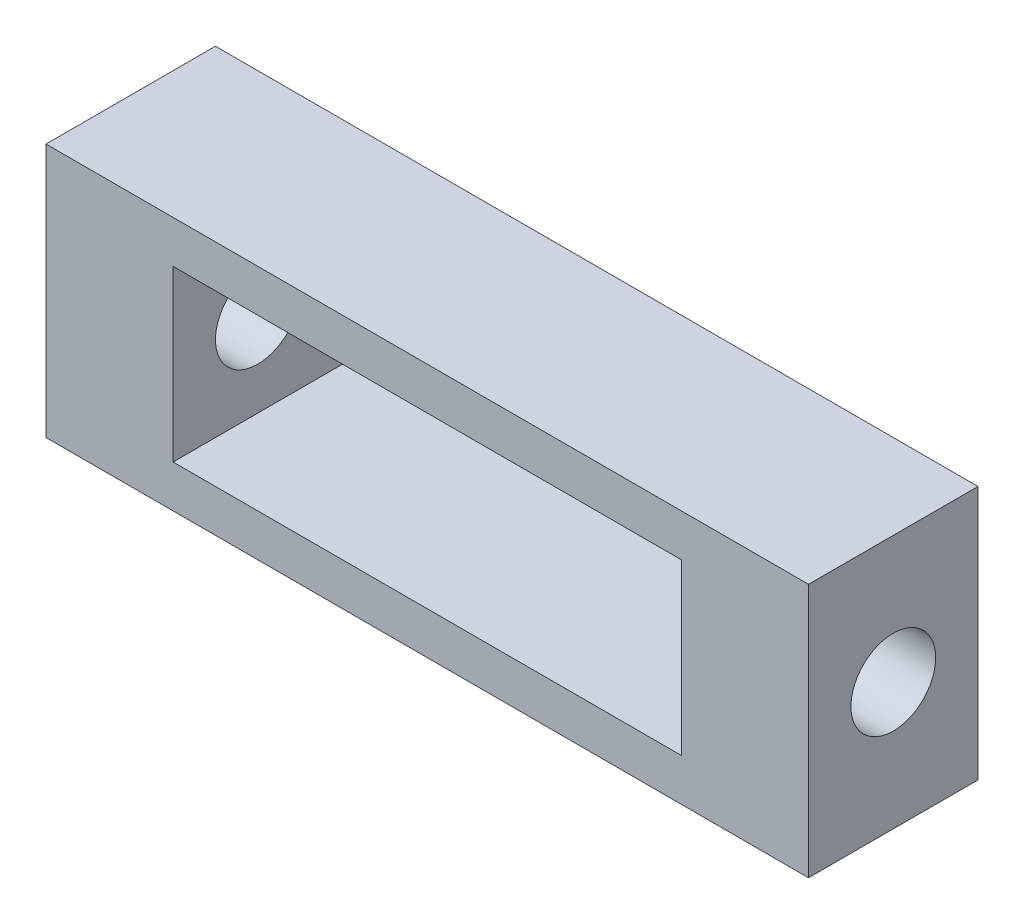
ISO-10303-21;
HEADER;
FILE_DESCRIPTION(('STEP AP214'),'2;1');
FILE_NAME('part.step','',(''),(''),'','','');
FILE_SCHEMA(('AUTOMOTIVE_DESIGN { 1 0 10303 214 1 1 1 1 }'));
ENDSEC;
DATA;
#1=APPLICATION_CONTEXT('core data for automotive mechanical design processes');
#2=APPLICATION_PROTOCOL_DEFINITION('international standard','automotive_design',2000,#1);
#3=PRODUCT_CONTEXT('',#1,'mechanical');
#4=PRODUCT('Part','Part','',(#3));
#5=PRODUCT_RELATED_PRODUCT_CATEGORY('part','',(#4));
#6=PRODUCT_DEFINITION_FORMATION('','',#4);
#7=PRODUCT_DEFINITION_CONTEXT('part definition',#1,'design');
#8=PRODUCT_DEFINITION('design','',#6,#7);
#9=PRODUCT_DEFINITION_SHAPE('','',#8);
#10=(LENGTH_UNIT() NAMED_UNIT(*) SI_UNIT(.MILLI.,.METRE.));
#11=(NAMED_UNIT(*) PLANE_ANGLE_UNIT() SI_UNIT($,.RADIAN.));
#12=(NAMED_UNIT(*) SI_UNIT($,.STERADIAN.) SOLID_ANGLE_UNIT());
#13=UNCERTAINTY_MEASURE_WITH_UNIT(LENGTH_MEASURE(1.E-05),#10,'distance_accuracy_value','');
#14=(GEOMETRIC_REPRESENTATION_CONTEXT(3) GLOBAL_UNCERTAINTY_ASSIGNED_CONTEXT((#13)) GLOBAL_UNIT_ASSIGNED_CONTEXT((#10,
#11,#12)) REPRESENTATION_CONTEXT('',''));
#15=CARTESIAN_POINT('',(0.,0.,0.));
#16=DIRECTION('',(0.,0.,1.));
#17=DIRECTION('',(1.,0.,0.));
#18=AXIS2_PLACEMENT_3D('',#15,#16,#17);
#19=CARTESIAN_POINT('',(0.,0.,10.));
#20=DIRECTION('',(0.,0.,1.));
#21=DIRECTION('',(1.,0.,0.));
#22=AXIS2_PLACEMENT_3D('',#19,#20,#21);
#23=PLANE('',#22);
#24=DIRECTION('',(0.,-1.,0.));
#25=VECTOR('',#24,1.);
#26=CARTESIAN_POINT('',(0.,0.,10.));
#27=LINE('',#26,#25);
#28=CARTESIAN_POINT('',(0.,0.,10.));
#29=VERTEX_POINT('',#28);
#30=CARTESIAN_POINT('',(0.,-15.,10.));
#31=VERTEX_POINT('',#30);
#32=EDGE_CURVE('E145',#29,#31,#27,.T.);
#33=ORIENTED_EDGE('',*,*,#32,.T.);
#34=DIRECTION('',(1.,0.,0.));
#35=VECTOR('',#34,1.);
#36=CARTESIAN_POINT('',(0.,-15.,10.));
#37=LINE('',#36,#35);
#38=CARTESIAN_POINT('',(45.,-15.,10.));
#39=VERTEX_POINT('',#38);
#40=EDGE_CURVE('E148',#31,#39,#37,.T.);
#41=ORIENTED_EDGE('',*,*,#40,.T.);
#42=DIRECTION('',(0.,1.,0.));
#43=VECTOR('',#42,1.);
#44=CARTESIAN_POINT('',(45.,0.,10.));
#45=LINE('',#44,#43);
#46=CARTESIAN_POINT('',(45.,0.,10.));
#47=VERTEX_POINT('',#46);
#48=EDGE_CURVE('E151',#39,#47,#45,.T.);
#49=ORIENTED_EDGE('',*,*,#48,.T.);
#50=DIRECTION('',(-1.,0.,0.));
#51=VECTOR('',#50,1.);
#52=CARTESIAN_POINT('',(0.,0.,10.));
#53=LINE('',#52,#51);
#54=EDGE_CURVE('E153',#47,#29,#53,.T.);
#55=ORIENTED_EDGE('',*,*,#54,.T.);
#56=EDGE_LOOP('',(#33,#41,#49,#55));
#57=FACE_BOUND('',#56,.T.);
#58=DIRECTION('',(1.,0.,0.));
#59=VECTOR('',#58,1.);
#60=CARTESIAN_POINT('',(7.5,-12.5,10.));
#61=LINE('',#60,#59);
#62=CARTESIAN_POINT('',(7.5,-12.5,10.));
#63=VERTEX_POINT('',#62);
#64=CARTESIAN_POINT('',(37.5,-12.5,10.));
#65=VERTEX_POINT('',#64);
#66=EDGE_CURVE('E115',#63,#65,#61,.T.);
#67=ORIENTED_EDGE('',*,*,#66,.F.);
#68=DIRECTION('',(0.,-1.,0.));
#69=VECTOR('',#68,1.);
#70=CARTESIAN_POINT('',(7.5,-2.5,10.));
#71=LINE('',#70,#69);
#72=CARTESIAN_POINT('',(7.5,-2.5,10.));
#73=VERTEX_POINT('',#72);
#74=EDGE_CURVE('E107',#73,#63,#71,.T.);
#75=ORIENTED_EDGE('',*,*,#74,.F.);
#76=DIRECTION('',(-1.,0.,0.));
#77=VECTOR('',#76,1.);
#78=CARTESIAN_POINT('',(7.5,-2.5,10.));
#79=LINE('',#78,#77);
#80=CARTESIAN_POINT('',(37.5,-2.5,10.));
#81=VERTEX_POINT('',#80);
#82=EDGE_CURVE('E129',#81,#73,#79,.T.);
#83=ORIENTED_EDGE('',*,*,#82,.F.);
#84=DIRECTION('',(0.,1.,0.));
#85=VECTOR('',#84,1.);
#86=CARTESIAN_POINT('',(37.5,-2.5,10.));
#87=LINE('',#86,#85);
#88=EDGE_CURVE('E127',#65,#81,#87,.T.);
#89=ORIENTED_EDGE('',*,*,#88,.F.);
#90=EDGE_LOOP('',(#67,#75,#83,#89));
#91=FACE_BOUND('',#90,.T.);
#92=ADVANCED_FACE('F41',(#57,#91),#23,.T.);
#93=CARTESIAN_POINT('',(0.,0.,0.));
#94=DIRECTION('',(0.,0.,1.));
#95=DIRECTION('',(1.,0.,0.));
#96=AXIS2_PLACEMENT_3D('',#93,#94,#95);
#97=PLANE('',#96);
#98=DIRECTION('',(0.,-1.,0.));
#99=VECTOR('',#98,1.);
#100=CARTESIAN_POINT('',(0.,0.,0.));
#101=LINE('',#100,#99);
#102=CARTESIAN_POINT('',(0.,0.,0.));
#103=VERTEX_POINT('',#102);
#104=CARTESIAN_POINT('',(0.,-15.,0.));
#105=VERTEX_POINT('',#104);
#106=EDGE_CURVE('E123',#103,#105,#101,.T.);
#107=ORIENTED_EDGE('',*,*,#106,.F.);
#108=DIRECTION('',(-1.,0.,0.));
#109=VECTOR('',#108,1.);
#110=CARTESIAN_POINT('',(0.,0.,0.));
#111=LINE('',#110,#109);
#112=CARTESIAN_POINT('',(45.,0.,0.));
#113=VERTEX_POINT('',#112);
#114=EDGE_CURVE('E149',#113,#103,#111,.T.);
#115=ORIENTED_EDGE('',*,*,#114,.F.);
#116=DIRECTION('',(0.,1.,0.));
#117=VECTOR('',#116,1.);
#118=CARTESIAN_POINT('',(45.,0.,0.));
#119=LINE('',#118,#117);
#120=CARTESIAN_POINT('',(45.,-15.,0.));
#121=VERTEX_POINT('',#120);
#122=EDGE_CURVE('E160',#121,#113,#119,.T.);
#123=ORIENTED_EDGE('',*,*,#122,.F.);
#124=DIRECTION('',(1.,0.,0.));
#125=VECTOR('',#124,1.);
#126=CARTESIAN_POINT('',(0.,-15.,0.));
#127=LINE('',#126,#125);
#128=EDGE_CURVE('E158',#105,#121,#127,.T.);
#129=ORIENTED_EDGE('',*,*,#128,.F.);
#130=EDGE_LOOP('',(#107,#115,#123,#129));
#131=FACE_BOUND('',#130,.T.);
#132=DIRECTION('',(0.,-1.,0.));
#133=VECTOR('',#132,1.);
#134=CARTESIAN_POINT('',(7.5,-2.5,0.));
#135=LINE('',#134,#133);
#136=CARTESIAN_POINT('',(7.5,-2.5,0.));
#137=VERTEX_POINT('',#136);
#138=CARTESIAN_POINT('',(7.5,-12.5,0.));
#139=VERTEX_POINT('',#138);
#140=EDGE_CURVE('E65',#137,#139,#135,.T.);
#141=ORIENTED_EDGE('',*,*,#140,.T.);
#142=DIRECTION('',(1.,0.,0.));
#143=VECTOR('',#142,1.);
#144=CARTESIAN_POINT('',(7.5,-12.5,0.));
#145=LINE('',#144,#143);
#146=CARTESIAN_POINT('',(37.5,-12.5,0.));
#147=VERTEX_POINT('',#146);
#148=EDGE_CURVE('E122',#139,#147,#145,.T.);
#149=ORIENTED_EDGE('',*,*,#148,.T.);
#150=DIRECTION('',(0.,1.,0.));
#151=VECTOR('',#150,1.);
#152=CARTESIAN_POINT('',(37.5,-2.5,0.));
#153=LINE('',#152,#151);
#154=CARTESIAN_POINT('',(37.5,-2.5,0.));
#155=VERTEX_POINT('',#154);
#156=EDGE_CURVE('E137',#147,#155,#153,.T.);
#157=ORIENTED_EDGE('',*,*,#156,.T.);
#158=DIRECTION('',(-1.,0.,0.));
#159=VECTOR('',#158,1.);
#160=CARTESIAN_POINT('',(7.5,-2.5,0.));
#161=LINE('',#160,#159);
#162=EDGE_CURVE('E116',#155,#137,#161,.T.);
#163=ORIENTED_EDGE('',*,*,#162,.T.);
#164=EDGE_LOOP('',(#141,#149,#157,#163));
#165=FACE_BOUND('',#164,.T.);
#166=ADVANCED_FACE('F179',(#131,#165),#97,.F.);
#167=CARTESIAN_POINT('',(0.,0.,10.));
#168=DIRECTION('',(1.,0.,0.));
#169=DIRECTION('',(0.,0.,-1.));
#170=AXIS2_PLACEMENT_3D('',#167,#168,#169);
#171=PLANE('',#170);
#172=CARTESIAN_POINT('',(0.,-7.5,5.));
#173=DIRECTION('',(1.,0.,0.));
#174=DIRECTION('',(0.,0.,-1.));
#175=AXIS2_PLACEMENT_3D('',#172,#173,#174);
#176=CIRCLE('',#175,2.5);
#177=CARTESIAN_POINT('',(0.,-7.5,2.5));
#178=VERTEX_POINT('',#177);
#179=EDGE_CURVE('E135',#178,#178,#176,.T.);
#180=ORIENTED_EDGE('',*,*,#179,.T.);
#181=EDGE_LOOP('',(#180));
#182=FACE_BOUND('',#181,.T.);
#183=ORIENTED_EDGE('',*,*,#106,.T.);
#184=DIRECTION('',(0.,0.,-1.));
#185=VECTOR('',#184,1.);
#186=CARTESIAN_POINT('',(0.,-15.,10.));
#187=LINE('',#186,#185);
#188=EDGE_CURVE('E11',#31,#105,#187,.T.);
#189=ORIENTED_EDGE('',*,*,#188,.F.);
#190=ORIENTED_EDGE('',*,*,#32,.F.);
#191=DIRECTION('',(0.,0.,-1.));
#192=VECTOR('',#191,1.);
#193=CARTESIAN_POINT('',(0.,0.,10.));
#194=LINE('',#193,#192);
#195=EDGE_CURVE('E155',#29,#103,#194,.T.);
#196=ORIENTED_EDGE('',*,*,#195,.T.);
#197=EDGE_LOOP('',(#183,#189,#190,#196));
#198=FACE_BOUND('',#197,.T.);
#199=ADVANCED_FACE('F43',(#182,#198),#171,.F.);
#200=CARTESIAN_POINT('',(0.,-15.,10.));
#201=DIRECTION('',(0.,1.,0.));
#202=DIRECTION('',(0.,0.,1.));
#203=AXIS2_PLACEMENT_3D('',#200,#201,#202);
#204=PLANE('',#203);
#205=ORIENTED_EDGE('',*,*,#128,.T.);
#206=DIRECTION('',(0.,0.,-1.));
#207=VECTOR('',#206,1.);
#208=CARTESIAN_POINT('',(45.,-15.,10.));
#209=LINE('',#208,#207);
#210=EDGE_CURVE('E50',#39,#121,#209,.T.);
#211=ORIENTED_EDGE('',*,*,#210,.F.);
#212=ORIENTED_EDGE('',*,*,#40,.F.);
#213=ORIENTED_EDGE('',*,*,#188,.T.);
#214=EDGE_LOOP('',(#205,#211,#212,#213));
#215=FACE_BOUND('',#214,.T.);
#216=ADVANCED_FACE('F189',(#215),#204,.F.);
#217=CARTESIAN_POINT('',(45.,0.,10.));
#218=DIRECTION('',(-1.,0.,0.));
#219=DIRECTION('',(0.,0.,1.));
#220=AXIS2_PLACEMENT_3D('',#217,#218,#219);
#221=PLANE('',#220);
#222=CARTESIAN_POINT('',(45.,-7.5,5.));
#223=DIRECTION('',(1.,0.,0.));
#224=DIRECTION('',(0.,0.,-1.));
#225=AXIS2_PLACEMENT_3D('',#222,#223,#224);
#226=CIRCLE('',#225,2.5);
#227=CARTESIAN_POINT('',(45.,-7.5,2.5));
#228=VERTEX_POINT('',#227);
#229=EDGE_CURVE('E223',#228,#228,#226,.T.);
#230=ORIENTED_EDGE('',*,*,#229,.F.);
#231=EDGE_LOOP('',(#230));
#232=FACE_BOUND('',#231,.T.);
#233=ORIENTED_EDGE('',*,*,#122,.T.);
#234=DIRECTION('',(0.,0.,-1.));
#235=VECTOR('',#234,1.);
#236=CARTESIAN_POINT('',(45.,0.,10.));
#237=LINE('',#236,#235);
#238=EDGE_CURVE('E165',#47,#113,#237,.T.);
#239=ORIENTED_EDGE('',*,*,#238,.F.);
#240=ORIENTED_EDGE('',*,*,#48,.F.);
#241=ORIENTED_EDGE('',*,*,#210,.T.);
#242=EDGE_LOOP('',(#233,#239,#240,#241));
#243=FACE_BOUND('',#242,.T.);
#244=ADVANCED_FACE('F173',(#232,#243),#221,.F.);
#245=CARTESIAN_POINT('',(0.,0.,10.));
#246=DIRECTION('',(0.,-1.,0.));
#247=DIRECTION('',(0.,0.,-1.));
#248=AXIS2_PLACEMENT_3D('',#245,#246,#247);
#249=PLANE('',#248);
#250=ORIENTED_EDGE('',*,*,#114,.T.);
#251=ORIENTED_EDGE('',*,*,#195,.F.);
#252=ORIENTED_EDGE('',*,*,#54,.F.);
#253=ORIENTED_EDGE('',*,*,#238,.T.);
#254=EDGE_LOOP('',(#250,#251,#252,#253));
#255=FACE_BOUND('',#254,.T.);
#256=ADVANCED_FACE('F183',(#255),#249,.F.);
#257=CARTESIAN_POINT('',(7.5,-2.5,10.));
#258=DIRECTION('',(1.,0.,0.));
#259=DIRECTION('',(0.,1.,0.));
#260=AXIS2_PLACEMENT_3D('',#257,#258,#259);
#261=PLANE('',#260);
#262=CARTESIAN_POINT('',(7.50000000000001,-7.5,5.));
#263=DIRECTION('',(1.,0.,0.));
#264=DIRECTION('',(0.,1.,0.));
#265=AXIS2_PLACEMENT_3D('',#262,#263,#264);
#266=CIRCLE('',#265,2.5);
#267=CARTESIAN_POINT('',(7.50000000000001,-5.,5.));
#268=VERTEX_POINT('',#267);
#269=EDGE_CURVE('E218',#268,#268,#266,.T.);
#270=ORIENTED_EDGE('',*,*,#269,.F.);
#271=EDGE_LOOP('',(#270));
#272=FACE_BOUND('',#271,.T.);
#273=ORIENTED_EDGE('',*,*,#140,.F.);
#274=DIRECTION('',(0.,0.,-1.));
#275=VECTOR('',#274,1.);
#276=CARTESIAN_POINT('',(7.5,-2.5,10.));
#277=LINE('',#276,#275);
#278=EDGE_CURVE('E111',#73,#137,#277,.T.);
#279=ORIENTED_EDGE('',*,*,#278,.F.);
#280=ORIENTED_EDGE('',*,*,#74,.T.);
#281=DIRECTION('',(0.,0.,-1.));
#282=VECTOR('',#281,1.);
#283=CARTESIAN_POINT('',(7.5,-12.5,10.));
#284=LINE('',#283,#282);
#285=EDGE_CURVE('E110',#63,#139,#284,.T.);
#286=ORIENTED_EDGE('',*,*,#285,.T.);
#287=EDGE_LOOP('',(#273,#279,#280,#286));
#288=FACE_BOUND('',#287,.T.);
#289=ADVANCED_FACE('F109',(#272,#288),#261,.T.);
#290=CARTESIAN_POINT('',(7.5,-12.5,10.));
#291=DIRECTION('',(0.,1.,0.));
#292=DIRECTION('',(0.,0.,1.));
#293=AXIS2_PLACEMENT_3D('',#290,#291,#292);
#294=PLANE('',#293);
#295=ORIENTED_EDGE('',*,*,#148,.F.);
#296=ORIENTED_EDGE('',*,*,#285,.F.);
#297=ORIENTED_EDGE('',*,*,#66,.T.);
#298=DIRECTION('',(0.,0.,-1.));
#299=VECTOR('',#298,1.);
#300=CARTESIAN_POINT('',(37.5,-12.5,10.));
#301=LINE('',#300,#299);
#302=EDGE_CURVE('E124',#65,#147,#301,.T.);
#303=ORIENTED_EDGE('',*,*,#302,.T.);
#304=EDGE_LOOP('',(#295,#296,#297,#303));
#305=FACE_BOUND('',#304,.T.);
#306=ADVANCED_FACE('F119',(#305),#294,.T.);
#307=CARTESIAN_POINT('',(37.5,-2.5,10.));
#308=DIRECTION('',(-1.,0.,0.));
#309=DIRECTION('',(0.,-1.,0.));
#310=AXIS2_PLACEMENT_3D('',#307,#308,#309);
#311=PLANE('',#310);
#312=CARTESIAN_POINT('',(37.5,-7.5,5.));
#313=DIRECTION('',(-1.,0.,0.));
#314=DIRECTION('',(0.,-1.,0.));
#315=AXIS2_PLACEMENT_3D('',#312,#313,#314);
#316=CIRCLE('',#315,2.5);
#317=CARTESIAN_POINT('',(37.5,-10.,5.));
#318=VERTEX_POINT('',#317);
#319=EDGE_CURVE('E45',#318,#318,#316,.T.);
#320=ORIENTED_EDGE('',*,*,#319,.F.);
#321=EDGE_LOOP('',(#320));
#322=FACE_BOUND('',#321,.T.);
#323=ORIENTED_EDGE('',*,*,#156,.F.);
#324=ORIENTED_EDGE('',*,*,#302,.F.);
#325=ORIENTED_EDGE('',*,*,#88,.T.);
#326=DIRECTION('',(0.,0.,-1.));
#327=VECTOR('',#326,1.);
#328=CARTESIAN_POINT('',(37.5,-2.5,10.));
#329=LINE('',#328,#327);
#330=EDGE_CURVE('E57',#81,#155,#329,.T.);
#331=ORIENTED_EDGE('',*,*,#330,.T.);
#332=EDGE_LOOP('',(#323,#324,#325,#331));
#333=FACE_BOUND('',#332,.T.);
#334=ADVANCED_FACE('F215',(#322,#333),#311,.T.);
#335=CARTESIAN_POINT('',(7.5,-2.5,10.));
#336=DIRECTION('',(0.,-1.,0.));
#337=DIRECTION('',(0.,0.,-1.));
#338=AXIS2_PLACEMENT_3D('',#335,#336,#337);
#339=PLANE('',#338);
#340=ORIENTED_EDGE('',*,*,#162,.F.);
#341=ORIENTED_EDGE('',*,*,#330,.F.);
#342=ORIENTED_EDGE('',*,*,#82,.T.);
#343=ORIENTED_EDGE('',*,*,#278,.T.);
#344=EDGE_LOOP('',(#340,#341,#342,#343));
#345=FACE_BOUND('',#344,.T.);
#346=ADVANCED_FACE('F231',(#345),#339,.T.);
#347=CARTESIAN_POINT('',(-62.0000000000001,-7.5,5.));
#348=DIRECTION('',(1.,0.,0.));
#349=DIRECTION('',(0.,0.,-1.));
#350=AXIS2_PLACEMENT_3D('',#347,#348,#349);
#351=CYLINDRICAL_SURFACE('',#350,2.5);
#352=ORIENTED_EDGE('',*,*,#319,.T.);
#353=EDGE_LOOP('',(#352));
#354=FACE_BOUND('',#353,.T.);
#355=ORIENTED_EDGE('',*,*,#229,.T.);
#356=EDGE_LOOP('',(#355));
#357=FACE_BOUND('',#356,.T.);
#358=ADVANCED_FACE('F228',(#354,#357),#351,.F.);
#359=ORIENTED_EDGE('',*,*,#269,.T.);
#360=EDGE_LOOP('',(#359));
#361=FACE_BOUND('',#360,.T.);
#362=ORIENTED_EDGE('',*,*,#179,.F.);
#363=EDGE_LOOP('',(#362));
#364=FACE_BOUND('',#363,.T.);
#365=ADVANCED_FACE('F230',(#361,#364),#351,.F.);
#366=CLOSED_SHELL('',(#92,#166,#199,#216,#244,#256,#289,#306,#334,#346,#358,#365));
#367=MANIFOLD_SOLID_BREP('B2',#366);
#368=ADVANCED_BREP_SHAPE_REPRESENTATION('',(#18,#367),#14);
#369=SHAPE_DEFINITION_REPRESENTATION(#9,#368);
ENDSEC;
END-ISO-10303-21;
